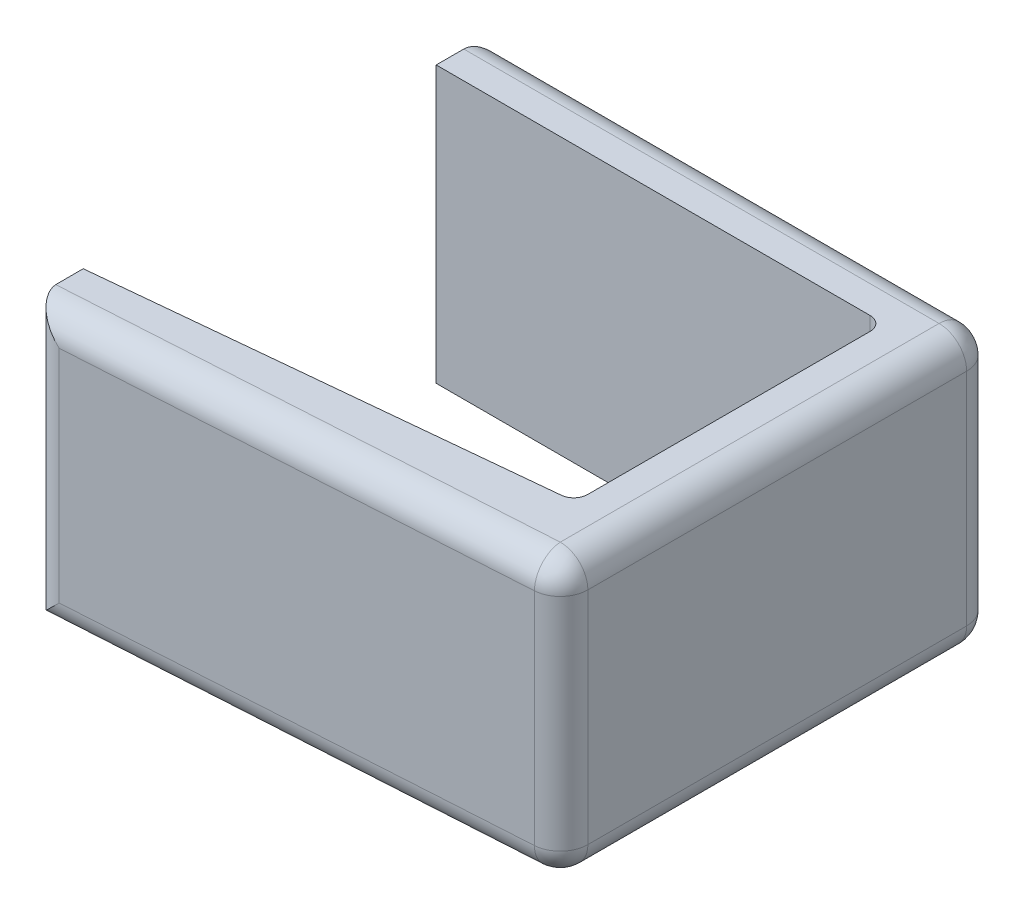
ISO-10303-21;
HEADER;
FILE_DESCRIPTION(('STEP AP214'),'2;1');
FILE_NAME('part.step','',(''),(''),'','','');
FILE_SCHEMA(('AUTOMOTIVE_DESIGN { 1 0 10303 214 1 1 1 1 }'));
ENDSEC;
DATA;
#1=APPLICATION_CONTEXT('core data for automotive mechanical design processes');
#2=APPLICATION_PROTOCOL_DEFINITION('international standard','automotive_design',2000,#1);
#3=PRODUCT_CONTEXT('',#1,'mechanical');
#4=PRODUCT('Part','Part','',(#3));
#5=PRODUCT_RELATED_PRODUCT_CATEGORY('part','',(#4));
#6=PRODUCT_DEFINITION_FORMATION('','',#4);
#7=PRODUCT_DEFINITION_CONTEXT('part definition',#1,'design');
#8=PRODUCT_DEFINITION('design','',#6,#7);
#9=PRODUCT_DEFINITION_SHAPE('','',#8);
#10=(LENGTH_UNIT() NAMED_UNIT(*) SI_UNIT(.MILLI.,.METRE.));
#11=(NAMED_UNIT(*) PLANE_ANGLE_UNIT() SI_UNIT($,.RADIAN.));
#12=(NAMED_UNIT(*) SI_UNIT($,.STERADIAN.) SOLID_ANGLE_UNIT());
#13=UNCERTAINTY_MEASURE_WITH_UNIT(LENGTH_MEASURE(1.E-05),#10,'distance_accuracy_value','');
#14=(GEOMETRIC_REPRESENTATION_CONTEXT(3) GLOBAL_UNCERTAINTY_ASSIGNED_CONTEXT((#13)) GLOBAL_UNIT_ASSIGNED_CONTEXT((#10,
#11,#12)) REPRESENTATION_CONTEXT('',''));
#15=CARTESIAN_POINT('',(0.,0.,0.));
#16=DIRECTION('',(0.,0.,1.));
#17=DIRECTION('',(1.,0.,0.));
#18=AXIS2_PLACEMENT_3D('',#15,#16,#17);
#19=CARTESIAN_POINT('',(8.11857707509881,10.,0.));
#20=DIRECTION('',(-1.,0.,0.));
#21=DIRECTION('',(0.,0.,1.));
#22=AXIS2_PLACEMENT_3D('',#19,#20,#21);
#23=PLANE('',#22);
#24=DIRECTION('',(0.,0.,-1.));
#25=VECTOR('',#24,1.);
#26=CARTESIAN_POINT('',(8.11857707509881,0.,0.));
#27=LINE('',#26,#25);
#28=CARTESIAN_POINT('',(8.11857707509881,0.,2.84684807689321));
#29=VERTEX_POINT('',#28);
#30=CARTESIAN_POINT('',(8.11857707509881,0.,-7.4));
#31=VERTEX_POINT('',#30);
#32=EDGE_CURVE('E205',#29,#31,#27,.T.);
#33=ORIENTED_EDGE('',*,*,#32,.F.);
#34=DIRECTION('',(0.,-1.,0.));
#35=VECTOR('',#34,1.);
#36=CARTESIAN_POINT('',(8.11857707509881,10.,2.84684807689321));
#37=LINE('',#36,#35);
#38=CARTESIAN_POINT('',(8.11857707509881,10.,2.84684807689321));
#39=VERTEX_POINT('',#38);
#40=EDGE_CURVE('E356',#29,#39,#37,.F.);
#41=ORIENTED_EDGE('',*,*,#40,.T.);
#42=DIRECTION('',(0.,0.,-1.));
#43=VECTOR('',#42,1.);
#44=CARTESIAN_POINT('',(8.11857707509881,10.,0.));
#45=LINE('',#44,#43);
#46=CARTESIAN_POINT('',(8.11857707509881,10.,-7.4));
#47=VERTEX_POINT('',#46);
#48=EDGE_CURVE('E192',#39,#47,#45,.T.);
#49=ORIENTED_EDGE('',*,*,#48,.T.);
#50=DIRECTION('',(0.,-1.,0.));
#51=VECTOR('',#50,1.);
#52=CARTESIAN_POINT('',(8.11857707509881,10.,-7.4));
#53=LINE('',#52,#51);
#54=EDGE_CURVE('E352',#47,#31,#53,.T.);
#55=ORIENTED_EDGE('',*,*,#54,.T.);
#56=EDGE_LOOP('',(#33,#41,#49,#55));
#57=FACE_BOUND('',#56,.T.);
#58=ADVANCED_FACE('F41',(#57),#23,.T.);
#59=CARTESIAN_POINT('',(0.400126448580113,10.,4.06057176572901));
#60=DIRECTION('',(-0.0980644813636399,0.,-0.995180062850377));
#61=DIRECTION('',(-0.995180062850377,0.,0.0980644813636399));
#62=AXIS2_PLACEMENT_3D('',#59,#60,#61);
#63=PLANE('',#62);
#64=DIRECTION('',(0.995180062850377,0.,-0.0980644813636399));
#65=VECTOR('',#64,1.);
#66=CARTESIAN_POINT('',(0.400126448580113,10.,4.06057176572901));
#67=LINE('',#66,#65);
#68=CARTESIAN_POINT('',(-8.11857707509882,10.,4.9));
#69=VERTEX_POINT('',#68);
#70=CARTESIAN_POINT('',(7.66760931578064,10.,3.3444381083184));
#71=VERTEX_POINT('',#70);
#72=EDGE_CURVE('E174',#69,#71,#67,.T.);
#73=ORIENTED_EDGE('',*,*,#72,.T.);
#74=DIRECTION('',(0.,-1.,0.));
#75=VECTOR('',#74,1.);
#76=CARTESIAN_POINT('',(7.66760931578063,0.,3.3444381083184));
#77=LINE('',#76,#75);
#78=CARTESIAN_POINT('',(7.66760931578064,0.,3.3444381083184));
#79=VERTEX_POINT('',#78);
#80=EDGE_CURVE('E289',#71,#79,#77,.T.);
#81=ORIENTED_EDGE('',*,*,#80,.T.);
#82=DIRECTION('',(0.995180062850377,0.,-0.0980644813636399));
#83=VECTOR('',#82,1.);
#84=CARTESIAN_POINT('',(0.400126448580113,0.,4.06057176572901));
#85=LINE('',#84,#83);
#86=CARTESIAN_POINT('',(-8.11857707509882,0.,4.9));
#87=VERTEX_POINT('',#86);
#88=EDGE_CURVE('E182',#87,#79,#85,.T.);
#89=ORIENTED_EDGE('',*,*,#88,.F.);
#90=DIRECTION('',(0.,-1.,0.));
#91=VECTOR('',#90,1.);
#92=CARTESIAN_POINT('',(-8.11857707509882,10.,4.9));
#93=LINE('',#92,#91);
#94=EDGE_CURVE('E166',#69,#87,#93,.T.);
#95=ORIENTED_EDGE('',*,*,#94,.F.);
#96=EDGE_LOOP('',(#73,#81,#89,#95));
#97=FACE_BOUND('',#96,.T.);
#98=ADVANCED_FACE('F178',(#97),#63,.T.);
#99=CARTESIAN_POINT('',(-8.11857707509882,10.,0.));
#100=DIRECTION('',(-1.,0.,0.));
#101=DIRECTION('',(0.,0.,1.));
#102=AXIS2_PLACEMENT_3D('',#99,#100,#101);
#103=PLANE('',#102);
#104=DIRECTION('',(0.,0.,-1.));
#105=VECTOR('',#104,1.);
#106=CARTESIAN_POINT('',(-8.11857707509882,0.,0.));
#107=LINE('',#106,#105);
#108=CARTESIAN_POINT('',(-8.11857707509882,0.,5.83651815956171));
#109=VERTEX_POINT('',#108);
#110=EDGE_CURVE('E211',#109,#87,#107,.T.);
#111=ORIENTED_EDGE('',*,*,#110,.F.);
#112=DIRECTION('',(0.,-1.,0.));
#113=VECTOR('',#112,1.);
#114=CARTESIAN_POINT('',(-8.11857707509882,10.,5.83651815956171));
#115=LINE('',#114,#113);
#116=CARTESIAN_POINT('',(-8.11857707509882,10.,5.83651815956171));
#117=VERTEX_POINT('',#116);
#118=EDGE_CURVE('E169',#109,#117,#115,.F.);
#119=ORIENTED_EDGE('',*,*,#118,.T.);
#120=DIRECTION('',(0.,0.,-1.));
#121=VECTOR('',#120,1.);
#122=CARTESIAN_POINT('',(-8.11857707509882,10.,0.));
#123=LINE('',#122,#121);
#124=EDGE_CURVE('E162',#117,#69,#123,.T.);
#125=ORIENTED_EDGE('',*,*,#124,.T.);
#126=ORIENTED_EDGE('',*,*,#94,.T.);
#127=EDGE_LOOP('',(#111,#119,#125,#126));
#128=FACE_BOUND('',#127,.T.);
#129=ADVANCED_FACE('F165',(#128),#103,.T.);
#130=CARTESIAN_POINT('',(0.392668359064545,10.,6.37581667603619));
#131=DIRECTION('',(-0.0614706789400056,0.,-0.99810888966618));
#132=DIRECTION('',(-0.99810888966618,0.,0.0614706789400056));
#133=AXIS2_PLACEMENT_3D('',#130,#131,#132);
#134=PLANE('',#133);
#135=DIRECTION('',(0.99810888966618,0.,-0.0614706789400056));
#136=VECTOR('',#135,1.);
#137=CARTESIAN_POINT('',(-8.11857707509882,9.,6.9));
#138=LINE('',#137,#136);
#139=CARTESIAN_POINT('',(9.18004775403882,9.,5.83462704922789));
#140=VERTEX_POINT('',#139);
#141=CARTESIAN_POINT('',(-7.05710639615881,9.,6.83462704922789));
#142=VERTEX_POINT('',#141);
#143=EDGE_CURVE('E227',#140,#142,#138,.F.);
#144=ORIENTED_EDGE('',*,*,#143,.T.);
#145=DIRECTION('',(0.,-1.,0.));
#146=VECTOR('',#145,1.);
#147=CARTESIAN_POINT('',(-7.05710639615881,0.,6.83462704922789));
#148=LINE('',#147,#146);
#149=CARTESIAN_POINT('',(-7.05710639615881,0.999999999999999,6.83462704922789));
#150=VERTEX_POINT('',#149);
#151=EDGE_CURVE('E230',#142,#150,#148,.T.);
#152=ORIENTED_EDGE('',*,*,#151,.T.);
#153=DIRECTION('',(0.99810888966618,0.,-0.0614706789400056));
#154=VECTOR('',#153,1.);
#155=CARTESIAN_POINT('',(0.392668359064545,0.999999999999999,6.37581667603619));
#156=LINE('',#155,#154);
#157=CARTESIAN_POINT('',(9.18004775403882,0.999999999999999,5.83462704922789));
#158=VERTEX_POINT('',#157);
#159=EDGE_CURVE('E224',#150,#158,#156,.T.);
#160=ORIENTED_EDGE('',*,*,#159,.T.);
#161=DIRECTION('',(0.,-1.,0.));
#162=VECTOR('',#161,1.);
#163=CARTESIAN_POINT('',(9.18004775403882,10.,5.83462704922789));
#164=LINE('',#163,#162);
#165=EDGE_CURVE('E184',#158,#140,#164,.F.);
#166=ORIENTED_EDGE('',*,*,#165,.T.);
#167=EDGE_LOOP('',(#144,#152,#160,#166));
#168=FACE_BOUND('',#167,.T.);
#169=ADVANCED_FACE('F490',(#168),#134,.F.);
#170=CARTESIAN_POINT('',(10.1185770750988,10.,0.));
#171=DIRECTION('',(-1.,0.,0.));
#172=DIRECTION('',(0.,0.,1.));
#173=AXIS2_PLACEMENT_3D('',#170,#171,#172);
#174=PLANE('',#173);
#175=DIRECTION('',(0.,0.,-1.));
#176=VECTOR('',#175,1.);
#177=CARTESIAN_POINT('',(10.1185770750988,9.,5.77682570593963));
#178=LINE('',#177,#176);
#179=CARTESIAN_POINT('',(10.1185770750988,9.,-8.9));
#180=VERTEX_POINT('',#179);
#181=CARTESIAN_POINT('',(10.1185770750988,9.,4.83651815956171));
#182=VERTEX_POINT('',#181);
#183=EDGE_CURVE('E282',#180,#182,#178,.F.);
#184=ORIENTED_EDGE('',*,*,#183,.T.);
#185=DIRECTION('',(0.,-1.,0.));
#186=VECTOR('',#185,1.);
#187=CARTESIAN_POINT('',(10.1185770750988,10.,4.83651815956171));
#188=LINE('',#187,#186);
#189=CARTESIAN_POINT('',(10.1185770750988,0.999999999999999,4.83651815956171));
#190=VERTEX_POINT('',#189);
#191=EDGE_CURVE('E285',#182,#190,#188,.T.);
#192=ORIENTED_EDGE('',*,*,#191,.T.);
#193=DIRECTION('',(0.,0.,-1.));
#194=VECTOR('',#193,1.);
#195=CARTESIAN_POINT('',(10.1185770750988,0.999999999999999,0.));
#196=LINE('',#195,#194);
#197=CARTESIAN_POINT('',(10.1185770750988,0.999999999999999,-8.9));
#198=VERTEX_POINT('',#197);
#199=EDGE_CURVE('E276',#190,#198,#196,.T.);
#200=ORIENTED_EDGE('',*,*,#199,.T.);
#201=DIRECTION('',(0.,-1.,0.));
#202=VECTOR('',#201,1.);
#203=CARTESIAN_POINT('',(10.1185770750988,10.,-8.9));
#204=LINE('',#203,#202);
#205=EDGE_CURVE('E279',#198,#180,#204,.F.);
#206=ORIENTED_EDGE('',*,*,#205,.T.);
#207=EDGE_LOOP('',(#184,#192,#200,#206));
#208=FACE_BOUND('',#207,.T.);
#209=ADVANCED_FACE('F471',(#208),#174,.F.);
#210=CARTESIAN_POINT('',(0.,10.,-9.9));
#211=DIRECTION('',(0.,0.,-1.));
#212=DIRECTION('',(-1.,0.,0.));
#213=AXIS2_PLACEMENT_3D('',#210,#211,#212);
#214=PLANE('',#213);
#215=DIRECTION('',(0.,-1.,0.));
#216=VECTOR('',#215,1.);
#217=CARTESIAN_POINT('',(-7.11857707509881,10.,-9.9));
#218=LINE('',#217,#216);
#219=CARTESIAN_POINT('',(-7.11857707509881,1.,-9.9));
#220=VERTEX_POINT('',#219);
#221=CARTESIAN_POINT('',(-7.11857707509881,9.,-9.9));
#222=VERTEX_POINT('',#221);
#223=EDGE_CURVE('E266',#220,#222,#218,.F.);
#224=ORIENTED_EDGE('',*,*,#223,.T.);
#225=DIRECTION('',(1.,0.,0.));
#226=VECTOR('',#225,1.);
#227=CARTESIAN_POINT('',(0.,9.,-9.9));
#228=LINE('',#227,#226);
#229=CARTESIAN_POINT('',(9.11857707509881,9.,-9.9));
#230=VERTEX_POINT('',#229);
#231=EDGE_CURVE('E269',#222,#230,#228,.T.);
#232=ORIENTED_EDGE('',*,*,#231,.T.);
#233=DIRECTION('',(0.,-1.,0.));
#234=VECTOR('',#233,1.);
#235=CARTESIAN_POINT('',(9.11857707509881,0.,-9.9));
#236=LINE('',#235,#234);
#237=CARTESIAN_POINT('',(9.11857707509881,1.,-9.9));
#238=VERTEX_POINT('',#237);
#239=EDGE_CURVE('E260',#230,#238,#236,.T.);
#240=ORIENTED_EDGE('',*,*,#239,.T.);
#241=DIRECTION('',(1.,0.,0.));
#242=VECTOR('',#241,1.);
#243=CARTESIAN_POINT('',(-8.11857707509881,1.,-9.9));
#244=LINE('',#243,#242);
#245=EDGE_CURVE('E263',#238,#220,#244,.F.);
#246=ORIENTED_EDGE('',*,*,#245,.T.);
#247=EDGE_LOOP('',(#224,#232,#240,#246));
#248=FACE_BOUND('',#247,.T.);
#249=ADVANCED_FACE('F481',(#248),#214,.T.);
#250=CARTESIAN_POINT('',(-8.11857707509881,10.,0.));
#251=DIRECTION('',(-1.,0.,0.));
#252=DIRECTION('',(0.,0.,1.));
#253=AXIS2_PLACEMENT_3D('',#250,#251,#252);
#254=PLANE('',#253);
#255=DIRECTION('',(0.,0.,-1.));
#256=VECTOR('',#255,1.);
#257=CARTESIAN_POINT('',(-8.11857707509881,10.,0.));
#258=LINE('',#257,#256);
#259=CARTESIAN_POINT('',(-8.11857707509881,10.,-7.9));
#260=VERTEX_POINT('',#259);
#261=CARTESIAN_POINT('',(-8.11857707509881,10.,-8.9));
#262=VERTEX_POINT('',#261);
#263=EDGE_CURVE('E173',#260,#262,#258,.T.);
#264=ORIENTED_EDGE('',*,*,#263,.T.);
#265=DIRECTION('',(0.,-1.,0.));
#266=VECTOR('',#265,1.);
#267=CARTESIAN_POINT('',(-8.11857707509881,10.,-8.9));
#268=LINE('',#267,#266);
#269=CARTESIAN_POINT('',(-8.11857707509881,0.,-8.9));
#270=VERTEX_POINT('',#269);
#271=EDGE_CURVE('E273',#262,#270,#268,.T.);
#272=ORIENTED_EDGE('',*,*,#271,.T.);
#273=DIRECTION('',(0.,0.,-1.));
#274=VECTOR('',#273,1.);
#275=CARTESIAN_POINT('',(-8.11857707509881,0.,0.));
#276=LINE('',#275,#274);
#277=CARTESIAN_POINT('',(-8.11857707509881,0.,-7.9));
#278=VERTEX_POINT('',#277);
#279=EDGE_CURVE('E214',#278,#270,#276,.T.);
#280=ORIENTED_EDGE('',*,*,#279,.F.);
#281=DIRECTION('',(0.,-1.,0.));
#282=VECTOR('',#281,1.);
#283=CARTESIAN_POINT('',(-8.11857707509881,10.,-7.9));
#284=LINE('',#283,#282);
#285=EDGE_CURVE('E185',#260,#278,#284,.T.);
#286=ORIENTED_EDGE('',*,*,#285,.F.);
#287=EDGE_LOOP('',(#264,#272,#280,#286));
#288=FACE_BOUND('',#287,.T.);
#289=ADVANCED_FACE('F457',(#288),#254,.T.);
#290=CARTESIAN_POINT('',(0.,10.,-7.9));
#291=DIRECTION('',(0.,0.,-1.));
#292=DIRECTION('',(-1.,0.,0.));
#293=AXIS2_PLACEMENT_3D('',#290,#291,#292);
#294=PLANE('',#293);
#295=DIRECTION('',(1.,0.,0.));
#296=VECTOR('',#295,1.);
#297=CARTESIAN_POINT('',(0.,0.,-7.9));
#298=LINE('',#297,#296);
#299=CARTESIAN_POINT('',(7.61857707509881,0.,-7.9));
#300=VERTEX_POINT('',#299);
#301=EDGE_CURVE('E196',#278,#300,#298,.T.);
#302=ORIENTED_EDGE('',*,*,#301,.T.);
#303=DIRECTION('',(0.,-1.,0.));
#304=VECTOR('',#303,1.);
#305=CARTESIAN_POINT('',(7.61857707509881,10.,-7.9));
#306=LINE('',#305,#304);
#307=CARTESIAN_POINT('',(7.61857707509881,10.,-7.9));
#308=VERTEX_POINT('',#307);
#309=EDGE_CURVE('E57',#300,#308,#306,.F.);
#310=ORIENTED_EDGE('',*,*,#309,.T.);
#311=DIRECTION('',(1.,0.,0.));
#312=VECTOR('',#311,1.);
#313=CARTESIAN_POINT('',(0.,10.,-7.9));
#314=LINE('',#313,#312);
#315=EDGE_CURVE('E202',#260,#308,#314,.T.);
#316=ORIENTED_EDGE('',*,*,#315,.F.);
#317=ORIENTED_EDGE('',*,*,#285,.T.);
#318=EDGE_LOOP('',(#302,#310,#316,#317));
#319=FACE_BOUND('',#318,.T.);
#320=ADVANCED_FACE('F488',(#319),#294,.F.);
#321=CARTESIAN_POINT('',(0.,10.,0.));
#322=DIRECTION('',(0.,1.,0.));
#323=DIRECTION('',(0.,0.,1.));
#324=AXIS2_PLACEMENT_3D('',#321,#322,#323);
#325=PLANE('',#324);
#326=ORIENTED_EDGE('',*,*,#124,.F.);
#327=CARTESIAN_POINT('',(-7.11857707509882,10.,5.83651815956171));
#328=DIRECTION('',(0.,1.,0.));
#329=DIRECTION('',(0.,0.,1.));
#330=AXIS2_PLACEMENT_3D('',#327,#328,#329);
#331=CIRCLE('',#330,1.);
#332=CARTESIAN_POINT('',(-8.116685964765,10.,5.89798883850172));
#333=VERTEX_POINT('',#332);
#334=EDGE_CURVE('E257',#117,#333,#331,.T.);
#335=ORIENTED_EDGE('',*,*,#334,.T.);
#336=DIRECTION('',(0.99810888966618,0.,-0.0614706789400056));
#337=VECTOR('',#336,1.);
#338=CARTESIAN_POINT('',(10.0571063961588,10.,4.77871681627345));
#339=LINE('',#338,#337);
#340=CARTESIAN_POINT('',(9.11857707509881,10.,4.83651815956171));
#341=VERTEX_POINT('',#340);
#342=EDGE_CURVE('E254',#333,#341,#339,.T.);
#343=ORIENTED_EDGE('',*,*,#342,.T.);
#344=DIRECTION('',(0.,0.,-1.));
#345=VECTOR('',#344,1.);
#346=CARTESIAN_POINT('',(9.11857707509881,10.,-9.9));
#347=LINE('',#346,#345);
#348=CARTESIAN_POINT('',(9.11857707509881,10.,-8.9));
#349=VERTEX_POINT('',#348);
#350=EDGE_CURVE('E248',#341,#349,#347,.T.);
#351=ORIENTED_EDGE('',*,*,#350,.T.);
#352=DIRECTION('',(1.,0.,0.));
#353=VECTOR('',#352,1.);
#354=CARTESIAN_POINT('',(0.,10.,-8.9));
#355=LINE('',#354,#353);
#356=EDGE_CURVE('E251',#349,#262,#355,.F.);
#357=ORIENTED_EDGE('',*,*,#356,.T.);
#358=ORIENTED_EDGE('',*,*,#263,.F.);
#359=ORIENTED_EDGE('',*,*,#315,.T.);
#360=CARTESIAN_POINT('',(7.61857707509881,10.,-7.4));
#361=DIRECTION('',(0.,1.,0.));
#362=DIRECTION('',(0.,0.,1.));
#363=AXIS2_PLACEMENT_3D('',#360,#361,#362);
#364=CIRCLE('',#363,0.5);
#365=EDGE_CURVE('E11',#308,#47,#364,.F.);
#366=ORIENTED_EDGE('',*,*,#365,.T.);
#367=ORIENTED_EDGE('',*,*,#48,.F.);
#368=CARTESIAN_POINT('',(7.61857707509881,10.,2.84684807689321));
#369=DIRECTION('',(0.,1.,0.));
#370=DIRECTION('',(0.,0.,1.));
#371=AXIS2_PLACEMENT_3D('',#368,#369,#370);
#372=CIRCLE('',#371,0.5);
#373=EDGE_CURVE('E190',#39,#71,#372,.F.);
#374=ORIENTED_EDGE('',*,*,#373,.T.);
#375=ORIENTED_EDGE('',*,*,#72,.F.);
#376=EDGE_LOOP('',(#326,#335,#343,#351,#357,#358,#359,#366,#367,#374,#375));
#377=FACE_BOUND('',#376,.T.);
#378=ADVANCED_FACE('F187',(#377),#325,.T.);
#379=CARTESIAN_POINT('',(0.,0.,0.));
#380=DIRECTION('',(0.,1.,0.));
#381=DIRECTION('',(0.,0.,1.));
#382=AXIS2_PLACEMENT_3D('',#379,#380,#381);
#383=PLANE('',#382);
#384=DIRECTION('',(0.99810888966618,0.,-0.0614706789400056));
#385=VECTOR('',#384,1.);
#386=CARTESIAN_POINT('',(0.33119768012454,0.,5.37770778637001));
#387=LINE('',#386,#385);
#388=CARTESIAN_POINT('',(9.11857707509881,0.,4.83651815956171));
#389=VERTEX_POINT('',#388);
#390=CARTESIAN_POINT('',(-8.116685964765,0.,5.89798883850172));
#391=VERTEX_POINT('',#390);
#392=EDGE_CURVE('E240',#389,#391,#387,.F.);
#393=ORIENTED_EDGE('',*,*,#392,.T.);
#394=CARTESIAN_POINT('',(-7.11857707509882,0.,5.83651815956171));
#395=DIRECTION('',(0.,1.,0.));
#396=DIRECTION('',(0.,0.,1.));
#397=AXIS2_PLACEMENT_3D('',#394,#395,#396);
#398=CIRCLE('',#397,1.);
#399=EDGE_CURVE('E243',#391,#109,#398,.F.);
#400=ORIENTED_EDGE('',*,*,#399,.T.);
#401=ORIENTED_EDGE('',*,*,#110,.T.);
#402=ORIENTED_EDGE('',*,*,#88,.T.);
#403=CARTESIAN_POINT('',(7.61857707509881,0.,2.84684807689321));
#404=DIRECTION('',(0.,1.,0.));
#405=DIRECTION('',(0.,0.,1.));
#406=AXIS2_PLACEMENT_3D('',#403,#404,#405);
#407=CIRCLE('',#406,0.5);
#408=EDGE_CURVE('E361',#79,#29,#407,.T.);
#409=ORIENTED_EDGE('',*,*,#408,.T.);
#410=ORIENTED_EDGE('',*,*,#32,.T.);
#411=CARTESIAN_POINT('',(7.61857707509881,0.,-7.4));
#412=DIRECTION('',(0.,1.,0.));
#413=DIRECTION('',(0.,0.,1.));
#414=AXIS2_PLACEMENT_3D('',#411,#412,#413);
#415=CIRCLE('',#414,0.5);
#416=EDGE_CURVE('E50',#31,#300,#415,.T.);
#417=ORIENTED_EDGE('',*,*,#416,.T.);
#418=ORIENTED_EDGE('',*,*,#301,.F.);
#419=ORIENTED_EDGE('',*,*,#279,.T.);
#420=DIRECTION('',(1.,0.,0.));
#421=VECTOR('',#420,1.);
#422=CARTESIAN_POINT('',(10.1185770750988,0.,-8.9));
#423=LINE('',#422,#421);
#424=CARTESIAN_POINT('',(9.11857707509881,0.,-8.9));
#425=VERTEX_POINT('',#424);
#426=EDGE_CURVE('E237',#270,#425,#423,.T.);
#427=ORIENTED_EDGE('',*,*,#426,.T.);
#428=DIRECTION('',(0.,0.,-1.));
#429=VECTOR('',#428,1.);
#430=CARTESIAN_POINT('',(9.11857707509881,0.,0.));
#431=LINE('',#430,#429);
#432=EDGE_CURVE('E234',#425,#389,#431,.F.);
#433=ORIENTED_EDGE('',*,*,#432,.T.);
#434=EDGE_LOOP('',(#393,#400,#401,#402,#409,#410,#417,#418,#419,#427,#433));
#435=FACE_BOUND('',#434,.T.);
#436=ADVANCED_FACE('F367',(#435),#383,.F.);
#437=CARTESIAN_POINT('',(-7.11857707509881,10.,-8.9));
#438=DIRECTION('',(0.,-1.,0.));
#439=DIRECTION('',(0.,0.,-1.));
#440=AXIS2_PLACEMENT_3D('',#437,#438,#439);
#441=CYLINDRICAL_SURFACE('',#440,1.);
#442=CARTESIAN_POINT('',(-7.11857707509881,1.,-8.9));
#443=DIRECTION('',(-0.707106781186547,0.707106781186547,0.));
#444=DIRECTION('',(-0.707106781186547,-0.707106781186547,0.));
#445=AXIS2_PLACEMENT_3D('',#442,#443,#444);
#446=ELLIPSE('',#445,1.41421356237309,1.);
#447=EDGE_CURVE('E343',#270,#220,#446,.F.);
#448=ORIENTED_EDGE('',*,*,#447,.F.);
#449=ORIENTED_EDGE('',*,*,#271,.F.);
#450=CARTESIAN_POINT('',(-7.11857707509881,9.,-8.9));
#451=DIRECTION('',(-0.707106781186547,-0.707106781186547,0.));
#452=DIRECTION('',(0.707106781186547,-0.707106781186547,0.));
#453=AXIS2_PLACEMENT_3D('',#450,#451,#452);
#454=ELLIPSE('',#453,1.41421356237309,1.);
#455=EDGE_CURVE('E208',#222,#262,#454,.F.);
#456=ORIENTED_EDGE('',*,*,#455,.F.);
#457=ORIENTED_EDGE('',*,*,#223,.F.);
#458=EDGE_LOOP('',(#448,#449,#456,#457));
#459=FACE_BOUND('',#458,.T.);
#460=ADVANCED_FACE('F437',(#459),#441,.T.);
#461=CARTESIAN_POINT('',(0.,9.,-8.9));
#462=DIRECTION('',(1.,0.,0.));
#463=DIRECTION('',(0.,0.,-1.));
#464=AXIS2_PLACEMENT_3D('',#461,#462,#463);
#465=CYLINDRICAL_SURFACE('',#464,1.);
#466=ORIENTED_EDGE('',*,*,#455,.T.);
#467=ORIENTED_EDGE('',*,*,#356,.F.);
#468=CARTESIAN_POINT('',(9.11857707509881,9.,-8.9));
#469=DIRECTION('',(1.,0.,0.));
#470=DIRECTION('',(0.,1.,0.));
#471=AXIS2_PLACEMENT_3D('',#468,#469,#470);
#472=CIRCLE('',#471,1.);
#473=EDGE_CURVE('E339',#230,#349,#472,.T.);
#474=ORIENTED_EDGE('',*,*,#473,.F.);
#475=ORIENTED_EDGE('',*,*,#231,.F.);
#476=EDGE_LOOP('',(#466,#467,#474,#475));
#477=FACE_BOUND('',#476,.T.);
#478=ADVANCED_FACE('F434',(#477),#465,.T.);
#479=CARTESIAN_POINT('',(9.11857707509881,10.,-8.9));
#480=DIRECTION('',(0.,1.,0.));
#481=DIRECTION('',(0.,0.,1.));
#482=AXIS2_PLACEMENT_3D('',#479,#480,#481);
#483=CYLINDRICAL_SURFACE('',#482,1.);
#484=CARTESIAN_POINT('',(9.11857707509881,1.,-8.9));
#485=DIRECTION('',(0.,-1.,0.));
#486=DIRECTION('',(1.,0.,0.));
#487=AXIS2_PLACEMENT_3D('',#484,#485,#486);
#488=CIRCLE('',#487,1.);
#489=EDGE_CURVE('E332',#238,#198,#488,.T.);
#490=ORIENTED_EDGE('',*,*,#489,.F.);
#491=ORIENTED_EDGE('',*,*,#239,.F.);
#492=CARTESIAN_POINT('',(9.11857707509881,9.,-8.9));
#493=DIRECTION('',(0.,1.,0.));
#494=DIRECTION('',(0.,0.,1.));
#495=AXIS2_PLACEMENT_3D('',#492,#493,#494);
#496=CIRCLE('',#495,1.);
#497=EDGE_CURVE('E336',#180,#230,#496,.T.);
#498=ORIENTED_EDGE('',*,*,#497,.F.);
#499=ORIENTED_EDGE('',*,*,#205,.F.);
#500=EDGE_LOOP('',(#490,#491,#498,#499));
#501=FACE_BOUND('',#500,.T.);
#502=ADVANCED_FACE('F430',(#501),#483,.T.);
#503=CARTESIAN_POINT('',(0.,1.,-8.9));
#504=DIRECTION('',(-1.,0.,0.));
#505=DIRECTION('',(0.,0.,1.));
#506=AXIS2_PLACEMENT_3D('',#503,#504,#505);
#507=CYLINDRICAL_SURFACE('',#506,1.);
#508=ORIENTED_EDGE('',*,*,#447,.T.);
#509=ORIENTED_EDGE('',*,*,#245,.F.);
#510=CARTESIAN_POINT('',(9.11857707509881,1.,-8.9));
#511=DIRECTION('',(1.,0.,0.));
#512=DIRECTION('',(0.,0.,-1.));
#513=AXIS2_PLACEMENT_3D('',#510,#511,#512);
#514=CIRCLE('',#513,1.);
#515=EDGE_CURVE('E328',#425,#238,#514,.T.);
#516=ORIENTED_EDGE('',*,*,#515,.F.);
#517=ORIENTED_EDGE('',*,*,#426,.F.);
#518=EDGE_LOOP('',(#508,#509,#516,#517));
#519=FACE_BOUND('',#518,.T.);
#520=ADVANCED_FACE('F426',(#519),#507,.T.);
#521=CARTESIAN_POINT('',(9.11857707509881,9.,-8.9));
#522=DIRECTION('',(0.,0.,1.));
#523=DIRECTION('',(1.,0.,0.));
#524=AXIS2_PLACEMENT_3D('',#521,#522,#523);
#525=SPHERICAL_SURFACE('',#524,1.);
#526=ORIENTED_EDGE('',*,*,#497,.T.);
#527=ORIENTED_EDGE('',*,*,#473,.T.);
#528=CARTESIAN_POINT('',(9.11857707509881,9.,-8.9));
#529=DIRECTION('',(0.,0.,-1.));
#530=DIRECTION('',(-1.,0.,0.));
#531=AXIS2_PLACEMENT_3D('',#528,#529,#530);
#532=CIRCLE('',#531,1.);
#533=EDGE_CURVE('E324',#180,#349,#532,.F.);
#534=ORIENTED_EDGE('',*,*,#533,.F.);
#535=EDGE_LOOP('',(#526,#527,#534));
#536=FACE_BOUND('',#535,.T.);
#537=ADVANCED_FACE('F422',(#536),#525,.T.);
#538=CARTESIAN_POINT('',(9.11857707509881,1.,-8.9));
#539=DIRECTION('',(0.,0.,1.));
#540=DIRECTION('',(1.,0.,0.));
#541=AXIS2_PLACEMENT_3D('',#538,#539,#540);
#542=SPHERICAL_SURFACE('',#541,1.);
#543=ORIENTED_EDGE('',*,*,#515,.T.);
#544=ORIENTED_EDGE('',*,*,#489,.T.);
#545=CARTESIAN_POINT('',(9.11857707509881,0.999999999999999,-8.9));
#546=DIRECTION('',(0.,0.,-1.));
#547=DIRECTION('',(0.,1.,0.));
#548=AXIS2_PLACEMENT_3D('',#545,#546,#547);
#549=CIRCLE('',#548,1.);
#550=EDGE_CURVE('E320',#425,#198,#549,.F.);
#551=ORIENTED_EDGE('',*,*,#550,.F.);
#552=EDGE_LOOP('',(#543,#544,#551));
#553=FACE_BOUND('',#552,.T.);
#554=ADVANCED_FACE('F418',(#553),#542,.T.);
#555=CARTESIAN_POINT('',(9.11857707509881,9.,0.));
#556=DIRECTION('',(0.,0.,1.));
#557=DIRECTION('',(1.,0.,0.));
#558=AXIS2_PLACEMENT_3D('',#555,#556,#557);
#559=CYLINDRICAL_SURFACE('',#558,1.);
#560=ORIENTED_EDGE('',*,*,#533,.T.);
#561=ORIENTED_EDGE('',*,*,#350,.F.);
#562=CARTESIAN_POINT('',(9.11857707509881,9.,4.83651815956171));
#563=DIRECTION('',(0.,0.,1.));
#564=DIRECTION('',(0.,-1.,0.));
#565=AXIS2_PLACEMENT_3D('',#562,#563,#564);
#566=CIRCLE('',#565,1.);
#567=EDGE_CURVE('E316',#182,#341,#566,.T.);
#568=ORIENTED_EDGE('',*,*,#567,.F.);
#569=ORIENTED_EDGE('',*,*,#183,.F.);
#570=EDGE_LOOP('',(#560,#561,#568,#569));
#571=FACE_BOUND('',#570,.T.);
#572=ADVANCED_FACE('F414',(#571),#559,.T.);
#573=CARTESIAN_POINT('',(9.11857707509881,10.,4.83651815956171));
#574=DIRECTION('',(0.,-1.,0.));
#575=DIRECTION('',(0.,0.,-1.));
#576=AXIS2_PLACEMENT_3D('',#573,#574,#575);
#577=CYLINDRICAL_SURFACE('',#576,1.);
#578=CARTESIAN_POINT('',(9.11857707509881,0.999999999999999,4.83651815956171));
#579=DIRECTION('',(0.,-1.,0.));
#580=DIRECTION('',(0.,0.,-1.));
#581=AXIS2_PLACEMENT_3D('',#578,#579,#580);
#582=CIRCLE('',#581,1.);
#583=EDGE_CURVE('E308',#190,#158,#582,.T.);
#584=ORIENTED_EDGE('',*,*,#583,.F.);
#585=ORIENTED_EDGE('',*,*,#191,.F.);
#586=CARTESIAN_POINT('',(9.11857707509881,9.,4.83651815956171));
#587=DIRECTION('',(0.,1.,0.));
#588=DIRECTION('',(0.,0.,1.));
#589=AXIS2_PLACEMENT_3D('',#586,#587,#588);
#590=CIRCLE('',#589,1.);
#591=EDGE_CURVE('E312',#140,#182,#590,.T.);
#592=ORIENTED_EDGE('',*,*,#591,.F.);
#593=ORIENTED_EDGE('',*,*,#165,.F.);
#594=EDGE_LOOP('',(#584,#585,#592,#593));
#595=FACE_BOUND('',#594,.T.);
#596=ADVANCED_FACE('F410',(#595),#577,.T.);
#597=CARTESIAN_POINT('',(9.11857707509881,0.999999999999999,0.));
#598=DIRECTION('',(0.,0.,-1.));
#599=DIRECTION('',(-1.,0.,0.));
#600=AXIS2_PLACEMENT_3D('',#597,#598,#599);
#601=CYLINDRICAL_SURFACE('',#600,1.);
#602=ORIENTED_EDGE('',*,*,#550,.T.);
#603=ORIENTED_EDGE('',*,*,#199,.F.);
#604=CARTESIAN_POINT('',(9.11857707509881,1.,4.83651815956171));
#605=DIRECTION('',(0.,0.,1.));
#606=DIRECTION('',(1.,0.,0.));
#607=AXIS2_PLACEMENT_3D('',#604,#605,#606);
#608=CIRCLE('',#607,1.);
#609=EDGE_CURVE('E305',#389,#190,#608,.T.);
#610=ORIENTED_EDGE('',*,*,#609,.F.);
#611=ORIENTED_EDGE('',*,*,#432,.F.);
#612=EDGE_LOOP('',(#602,#603,#610,#611));
#613=FACE_BOUND('',#612,.T.);
#614=ADVANCED_FACE('F406',(#613),#601,.T.);
#615=CARTESIAN_POINT('',(9.11857707509881,9.,4.83651815956171));
#616=DIRECTION('',(0.,0.,1.));
#617=DIRECTION('',(1.,0.,0.));
#618=AXIS2_PLACEMENT_3D('',#615,#616,#617);
#619=SPHERICAL_SURFACE('',#618,1.);
#620=ORIENTED_EDGE('',*,*,#591,.T.);
#621=ORIENTED_EDGE('',*,*,#567,.T.);
#622=CARTESIAN_POINT('',(9.11857707509881,9.,4.83651815956171));
#623=DIRECTION('',(0.99810888966618,0.,-0.0614706789400059));
#624=DIRECTION('',(-0.0614706789400059,0.,-0.99810888966618));
#625=AXIS2_PLACEMENT_3D('',#622,#623,#624);
#626=CIRCLE('',#625,1.);
#627=EDGE_CURVE('E301',#140,#341,#626,.F.);
#628=ORIENTED_EDGE('',*,*,#627,.F.);
#629=EDGE_LOOP('',(#620,#621,#628));
#630=FACE_BOUND('',#629,.T.);
#631=ADVANCED_FACE('F402',(#630),#619,.T.);
#632=CARTESIAN_POINT('',(9.11857707509881,1.,4.83651815956171));
#633=DIRECTION('',(0.,0.,1.));
#634=DIRECTION('',(1.,0.,0.));
#635=AXIS2_PLACEMENT_3D('',#632,#633,#634);
#636=SPHERICAL_SURFACE('',#635,1.);
#637=ORIENTED_EDGE('',*,*,#609,.T.);
#638=ORIENTED_EDGE('',*,*,#583,.T.);
#639=CARTESIAN_POINT('',(9.11857707509881,0.999999999999999,4.83651815956171));
#640=DIRECTION('',(0.99810888966618,0.,-0.0614706789400059));
#641=DIRECTION('',(-0.0614706789400059,0.,-0.99810888966618));
#642=AXIS2_PLACEMENT_3D('',#639,#640,#641);
#643=CIRCLE('',#642,1.);
#644=EDGE_CURVE('E297',#389,#158,#643,.F.);
#645=ORIENTED_EDGE('',*,*,#644,.F.);
#646=EDGE_LOOP('',(#637,#638,#645));
#647=FACE_BOUND('',#646,.T.);
#648=ADVANCED_FACE('F398',(#647),#636,.T.);
#649=CARTESIAN_POINT('',(0.33119768012454,9.,5.37770778637001));
#650=DIRECTION('',(-0.99810888966618,0.,0.0614706789400056));
#651=DIRECTION('',(0.0614706789400056,0.,0.99810888966618));
#652=AXIS2_PLACEMENT_3D('',#649,#650,#651);
#653=CYLINDRICAL_SURFACE('',#652,1.);
#654=ORIENTED_EDGE('',*,*,#627,.T.);
#655=ORIENTED_EDGE('',*,*,#342,.F.);
#656=CARTESIAN_POINT('',(-7.11857707509882,9.,5.83651815956171));
#657=DIRECTION('',(-0.705769564245531,-0.707106781186547,0.043466333922619));
#658=DIRECTION('',(-0.705769564245531,0.707106781186547,0.043466333922619));
#659=AXIS2_PLACEMENT_3D('',#656,#657,#658);
#660=ELLIPSE('',#659,1.41421356237309,1.);
#661=EDGE_CURVE('E293',#142,#333,#660,.T.);
#662=ORIENTED_EDGE('',*,*,#661,.F.);
#663=ORIENTED_EDGE('',*,*,#143,.F.);
#664=EDGE_LOOP('',(#654,#655,#662,#663));
#665=FACE_BOUND('',#664,.T.);
#666=ADVANCED_FACE('F394',(#665),#653,.T.);
#667=CARTESIAN_POINT('',(0.33119768012454,0.999999999999999,5.37770778637001));
#668=DIRECTION('',(0.99810888966618,0.,-0.0614706789400056));
#669=DIRECTION('',(-0.0614706789400056,0.,-0.99810888966618));
#670=AXIS2_PLACEMENT_3D('',#667,#668,#669);
#671=CYLINDRICAL_SURFACE('',#670,1.);
#672=ORIENTED_EDGE('',*,*,#644,.T.);
#673=ORIENTED_EDGE('',*,*,#159,.F.);
#674=CARTESIAN_POINT('',(-7.11857707509882,0.999999999999999,5.83651815956171));
#675=DIRECTION('',(0.705769564245531,-0.707106781186547,-0.043466333922619));
#676=DIRECTION('',(0.705769564245531,0.707106781186547,-0.043466333922619));
#677=AXIS2_PLACEMENT_3D('',#674,#675,#676);
#678=ELLIPSE('',#677,1.41421356237309,1.);
#679=EDGE_CURVE('E290',#391,#150,#678,.F.);
#680=ORIENTED_EDGE('',*,*,#679,.F.);
#681=ORIENTED_EDGE('',*,*,#392,.F.);
#682=EDGE_LOOP('',(#672,#673,#680,#681));
#683=FACE_BOUND('',#682,.T.);
#684=ADVANCED_FACE('F380',(#683),#671,.T.);
#685=CARTESIAN_POINT('',(-7.11857707509882,10.,5.83651815956171));
#686=DIRECTION('',(0.,1.,0.));
#687=DIRECTION('',(0.,0.,1.));
#688=AXIS2_PLACEMENT_3D('',#685,#686,#687);
#689=CYLINDRICAL_SURFACE('',#688,1.);
#690=ORIENTED_EDGE('',*,*,#334,.F.);
#691=ORIENTED_EDGE('',*,*,#118,.F.);
#692=ORIENTED_EDGE('',*,*,#399,.F.);
#693=ORIENTED_EDGE('',*,*,#679,.T.);
#694=ORIENTED_EDGE('',*,*,#151,.F.);
#695=ORIENTED_EDGE('',*,*,#661,.T.);
#696=EDGE_LOOP('',(#690,#691,#692,#693,#694,#695));
#697=FACE_BOUND('',#696,.T.);
#698=ADVANCED_FACE('F374',(#697),#689,.T.);
#699=CARTESIAN_POINT('',(7.61857707509881,10.,2.84684807689321));
#700=DIRECTION('',(0.,1.,0.));
#701=DIRECTION('',(0.,0.,1.));
#702=AXIS2_PLACEMENT_3D('',#699,#700,#701);
#703=CYLINDRICAL_SURFACE('',#702,0.5);
#704=ORIENTED_EDGE('',*,*,#373,.F.);
#705=ORIENTED_EDGE('',*,*,#40,.F.);
#706=ORIENTED_EDGE('',*,*,#408,.F.);
#707=ORIENTED_EDGE('',*,*,#80,.F.);
#708=EDGE_LOOP('',(#704,#705,#706,#707));
#709=FACE_BOUND('',#708,.T.);
#710=ADVANCED_FACE('F372',(#709),#703,.F.);
#711=CARTESIAN_POINT('',(7.61857707509881,10.,-7.4));
#712=DIRECTION('',(0.,-1.,0.));
#713=DIRECTION('',(0.,0.,-1.));
#714=AXIS2_PLACEMENT_3D('',#711,#712,#713);
#715=CYLINDRICAL_SURFACE('',#714,0.5);
#716=ORIENTED_EDGE('',*,*,#365,.F.);
#717=ORIENTED_EDGE('',*,*,#309,.F.);
#718=ORIENTED_EDGE('',*,*,#416,.F.);
#719=ORIENTED_EDGE('',*,*,#54,.F.);
#720=EDGE_LOOP('',(#716,#717,#718,#719));
#721=FACE_BOUND('',#720,.T.);
#722=ADVANCED_FACE('F43',(#721),#715,.F.);
#723=CLOSED_SHELL('',(#58,#98,#129,#169,#209,#249,#289,#320,#378,#436,#460,#478,#502,#520,#537,
#554,#572,#596,#614,#631,#648,#666,#684,#698,#710,#722));
#724=MANIFOLD_SOLID_BREP('B2',#723);
#725=ADVANCED_BREP_SHAPE_REPRESENTATION('',(#18,#724),#14);
#726=SHAPE_DEFINITION_REPRESENTATION(#9,#725);
ENDSEC;
END-ISO-10303-21;
